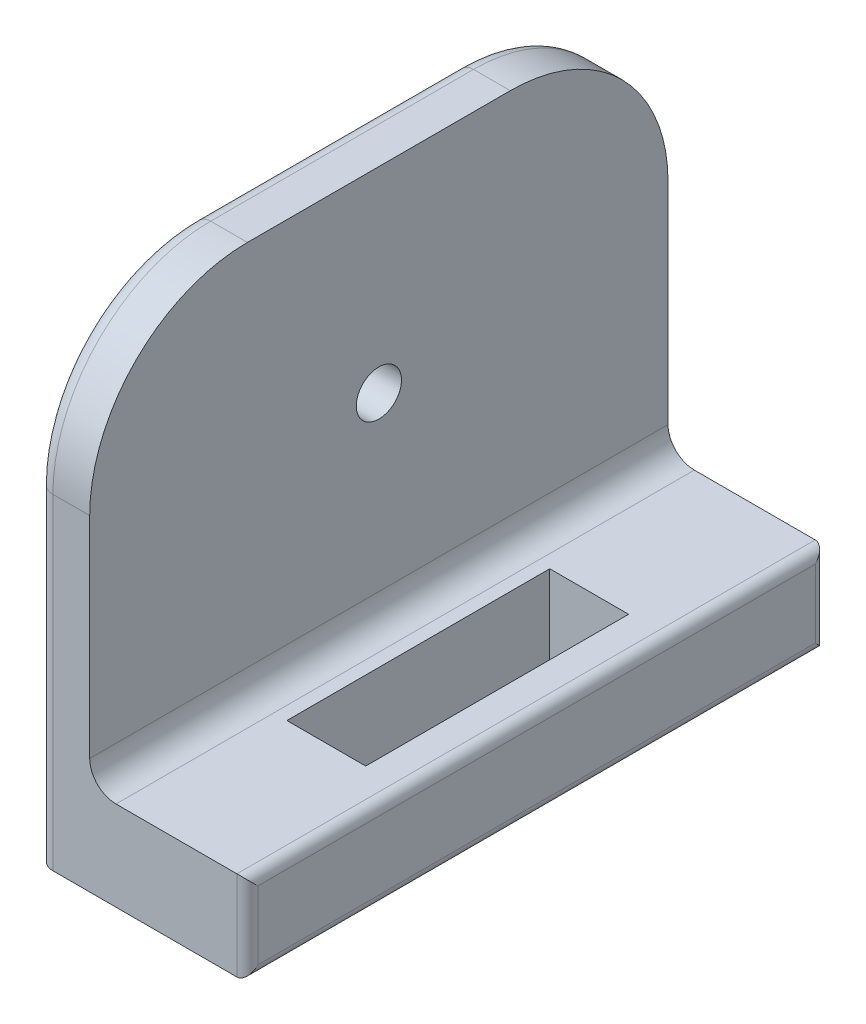
ISO-10303-21;
HEADER;
FILE_DESCRIPTION(('STEP AP214'),'2;1');
FILE_NAME('part.step','',(''),(''),'','','');
FILE_SCHEMA(('AUTOMOTIVE_DESIGN { 1 0 10303 214 1 1 1 1 }'));
ENDSEC;
DATA;
#1=APPLICATION_CONTEXT('core data for automotive mechanical design processes');
#2=APPLICATION_PROTOCOL_DEFINITION('international standard','automotive_design',2000,#1);
#3=PRODUCT_CONTEXT('',#1,'mechanical');
#4=PRODUCT('Part','Part','',(#3));
#5=PRODUCT_RELATED_PRODUCT_CATEGORY('part','',(#4));
#6=PRODUCT_DEFINITION_FORMATION('','',#4);
#7=PRODUCT_DEFINITION_CONTEXT('part definition',#1,'design');
#8=PRODUCT_DEFINITION('design','',#6,#7);
#9=PRODUCT_DEFINITION_SHAPE('','',#8);
#10=(LENGTH_UNIT() NAMED_UNIT(*) SI_UNIT(.MILLI.,.METRE.));
#11=(NAMED_UNIT(*) PLANE_ANGLE_UNIT() SI_UNIT($,.RADIAN.));
#12=(NAMED_UNIT(*) SI_UNIT($,.STERADIAN.) SOLID_ANGLE_UNIT());
#13=UNCERTAINTY_MEASURE_WITH_UNIT(LENGTH_MEASURE(1.E-05),#10,'distance_accuracy_value','');
#14=(GEOMETRIC_REPRESENTATION_CONTEXT(3) GLOBAL_UNCERTAINTY_ASSIGNED_CONTEXT((#13)) GLOBAL_UNIT_ASSIGNED_CONTEXT((#10,
#11,#12)) REPRESENTATION_CONTEXT('',''));
#15=CARTESIAN_POINT('',(0.,0.,0.));
#16=DIRECTION('',(0.,0.,1.));
#17=DIRECTION('',(1.,0.,0.));
#18=AXIS2_PLACEMENT_3D('',#15,#16,#17);
#19=CARTESIAN_POINT('',(0.,17.,0.));
#20=DIRECTION('',(0.,-1.,0.));
#21=DIRECTION('',(0.,0.,-1.));
#22=AXIS2_PLACEMENT_3D('',#19,#20,#21);
#23=PLANE('',#22);
#24=DIRECTION('',(0.,0.,-1.));
#25=VECTOR('',#24,1.);
#26=CARTESIAN_POINT('',(32.5,17.,-80.));
#27=LINE('',#26,#25);
#28=CARTESIAN_POINT('',(32.5,17.,-30.));
#29=VERTEX_POINT('',#28);
#30=CARTESIAN_POINT('',(32.5,17.,-80.));
#31=VERTEX_POINT('',#30);
#32=EDGE_CURVE('E201',#29,#31,#27,.T.);
#33=ORIENTED_EDGE('',*,*,#32,.F.);
#34=DIRECTION('',(1.,0.,0.));
#35=VECTOR('',#34,1.);
#36=CARTESIAN_POINT('',(17.5,17.,-30.));
#37=LINE('',#36,#35);
#38=CARTESIAN_POINT('',(17.5,17.,-30.));
#39=VERTEX_POINT('',#38);
#40=EDGE_CURVE('E190',#39,#29,#37,.T.);
#41=ORIENTED_EDGE('',*,*,#40,.F.);
#42=DIRECTION('',(0.,0.,1.));
#43=VECTOR('',#42,1.);
#44=CARTESIAN_POINT('',(17.5,17.,-80.));
#45=LINE('',#44,#43);
#46=CARTESIAN_POINT('',(17.5,17.,-80.));
#47=VERTEX_POINT('',#46);
#48=EDGE_CURVE('E205',#47,#39,#45,.T.);
#49=ORIENTED_EDGE('',*,*,#48,.F.);
#50=DIRECTION('',(-1.,0.,0.));
#51=VECTOR('',#50,1.);
#52=CARTESIAN_POINT('',(17.5,17.,-80.));
#53=LINE('',#52,#51);
#54=EDGE_CURVE('E198',#31,#47,#53,.T.);
#55=ORIENTED_EDGE('',*,*,#54,.F.);
#56=EDGE_LOOP('',(#33,#41,#49,#55));
#57=FACE_BOUND('',#56,.T.);
#58=DIRECTION('',(1.,0.,0.));
#59=VECTOR('',#58,1.);
#60=CARTESIAN_POINT('',(0.,17.,0.));
#61=LINE('',#60,#59);
#62=CARTESIAN_POINT('',(15.,17.,0.));
#63=VERTEX_POINT('',#62);
#64=CARTESIAN_POINT('',(38.,17.,0.));
#65=VERTEX_POINT('',#64);
#66=EDGE_CURVE('E233',#63,#65,#61,.T.);
#67=ORIENTED_EDGE('',*,*,#66,.T.);
#68=DIRECTION('',(0.,0.,-1.));
#69=VECTOR('',#68,1.);
#70=CARTESIAN_POINT('',(38.,17.,0.));
#71=LINE('',#70,#69);
#72=CARTESIAN_POINT('',(38.,17.,-110.));
#73=VERTEX_POINT('',#72);
#74=EDGE_CURVE('E70',#65,#73,#71,.T.);
#75=ORIENTED_EDGE('',*,*,#74,.T.);
#76=DIRECTION('',(-1.,0.,0.));
#77=VECTOR('',#76,1.);
#78=CARTESIAN_POINT('',(0.,17.,-110.));
#79=LINE('',#78,#77);
#80=CARTESIAN_POINT('',(15.,17.,-110.));
#81=VERTEX_POINT('',#80);
#82=EDGE_CURVE('E236',#73,#81,#79,.T.);
#83=ORIENTED_EDGE('',*,*,#82,.T.);
#84=DIRECTION('',(0.,0.,-1.));
#85=VECTOR('',#84,1.);
#86=CARTESIAN_POINT('',(15.,17.,0.));
#87=LINE('',#86,#85);
#88=EDGE_CURVE('E328',#81,#63,#87,.F.);
#89=ORIENTED_EDGE('',*,*,#88,.T.);
#90=EDGE_LOOP('',(#67,#75,#83,#89));
#91=FACE_BOUND('',#90,.T.);
#92=ADVANCED_FACE('F45',(#57,#91),#23,.F.);
#93=CARTESIAN_POINT('',(0.,17.,0.));
#94=DIRECTION('',(1.,0.,0.));
#95=DIRECTION('',(0.,0.,-1.));
#96=AXIS2_PLACEMENT_3D('',#93,#94,#95);
#97=PLANE('',#96);
#98=CARTESIAN_POINT('',(0.,54.7,-55.));
#99=DIRECTION('',(1.,0.,0.));
#100=DIRECTION('',(0.,0.,-1.));
#101=AXIS2_PLACEMENT_3D('',#98,#99,#100);
#102=CIRCLE('',#101,4.3);
#103=CARTESIAN_POINT('',(0.,54.7,-59.3));
#104=VERTEX_POINT('',#103);
#105=EDGE_CURVE('E667',#104,#104,#102,.F.);
#106=ORIENTED_EDGE('',*,*,#105,.F.);
#107=EDGE_LOOP('',(#106));
#108=FACE_BOUND('',#107,.T.);
#109=DIRECTION('',(0.,0.,1.));
#110=VECTOR('',#109,1.);
#111=CARTESIAN_POINT('',(0.,0.,0.));
#112=LINE('',#111,#110);
#113=CARTESIAN_POINT('',(0.,0.,-107.));
#114=VERTEX_POINT('',#113);
#115=CARTESIAN_POINT('',(0.,0.,-3.));
#116=VERTEX_POINT('',#115);
#117=EDGE_CURVE('E232',#114,#116,#112,.T.);
#118=ORIENTED_EDGE('',*,*,#117,.T.);
#119=DIRECTION('',(0.,-1.,0.));
#120=VECTOR('',#119,1.);
#121=CARTESIAN_POINT('',(0.,17.,-3.));
#122=LINE('',#121,#120);
#123=CARTESIAN_POINT('',(0.,62.,-3.));
#124=VERTEX_POINT('',#123);
#125=EDGE_CURVE('E283',#116,#124,#122,.F.);
#126=ORIENTED_EDGE('',*,*,#125,.T.);
#127=CARTESIAN_POINT('',(0.,62.,-30.));
#128=DIRECTION('',(1.,0.,0.));
#129=DIRECTION('',(0.,0.,-1.));
#130=AXIS2_PLACEMENT_3D('',#127,#128,#129);
#131=CIRCLE('',#130,27.);
#132=CARTESIAN_POINT('',(0.,89.,-30.));
#133=VERTEX_POINT('',#132);
#134=EDGE_CURVE('E279',#124,#133,#131,.F.);
#135=ORIENTED_EDGE('',*,*,#134,.T.);
#136=DIRECTION('',(0.,0.,1.));
#137=VECTOR('',#136,1.);
#138=CARTESIAN_POINT('',(0.,89.,0.));
#139=LINE('',#138,#137);
#140=CARTESIAN_POINT('',(0.,89.,-80.));
#141=VERTEX_POINT('',#140);
#142=EDGE_CURVE('E276',#133,#141,#139,.F.);
#143=ORIENTED_EDGE('',*,*,#142,.T.);
#144=CARTESIAN_POINT('',(0.,62.,-80.));
#145=DIRECTION('',(1.,0.,0.));
#146=DIRECTION('',(0.,0.,-1.));
#147=AXIS2_PLACEMENT_3D('',#144,#145,#146);
#148=CIRCLE('',#147,27.);
#149=CARTESIAN_POINT('',(0.,62.,-107.));
#150=VERTEX_POINT('',#149);
#151=EDGE_CURVE('E273',#141,#150,#148,.F.);
#152=ORIENTED_EDGE('',*,*,#151,.T.);
#153=DIRECTION('',(0.,-1.,0.));
#154=VECTOR('',#153,1.);
#155=CARTESIAN_POINT('',(0.,17.,-107.));
#156=LINE('',#155,#154);
#157=EDGE_CURVE('E270',#150,#114,#156,.T.);
#158=ORIENTED_EDGE('',*,*,#157,.T.);
#159=EDGE_LOOP('',(#118,#126,#135,#143,#152,#158));
#160=FACE_BOUND('',#159,.T.);
#161=ADVANCED_FACE('F402',(#108,#160),#97,.F.);
#162=CARTESIAN_POINT('',(0.,17.,0.));
#163=DIRECTION('',(0.,0.,-1.));
#164=DIRECTION('',(-1.,0.,0.));
#165=AXIS2_PLACEMENT_3D('',#162,#163,#164);
#166=PLANE('',#165);
#167=DIRECTION('',(1.,0.,0.));
#168=VECTOR('',#167,1.);
#169=CARTESIAN_POINT('',(0.,0.,0.));
#170=LINE('',#169,#168);
#171=CARTESIAN_POINT('',(3.,0.,0.));
#172=VERTEX_POINT('',#171);
#173=CARTESIAN_POINT('',(38.,0.,0.));
#174=VERTEX_POINT('',#173);
#175=EDGE_CURVE('E244',#172,#174,#170,.T.);
#176=ORIENTED_EDGE('',*,*,#175,.T.);
#177=DIRECTION('',(0.,-1.,0.));
#178=VECTOR('',#177,1.);
#179=CARTESIAN_POINT('',(38.,17.,0.));
#180=LINE('',#179,#178);
#181=EDGE_CURVE('E351',#174,#65,#180,.F.);
#182=ORIENTED_EDGE('',*,*,#181,.T.);
#183=ORIENTED_EDGE('',*,*,#66,.F.);
#184=CARTESIAN_POINT('',(15.,22.,0.));
#185=DIRECTION('',(0.,0.,-1.));
#186=DIRECTION('',(-1.,0.,0.));
#187=AXIS2_PLACEMENT_3D('',#184,#185,#186);
#188=CIRCLE('',#187,5.);
#189=CARTESIAN_POINT('',(10.,22.,0.));
#190=VERTEX_POINT('',#189);
#191=EDGE_CURVE('E335',#63,#190,#188,.T.);
#192=ORIENTED_EDGE('',*,*,#191,.T.);
#193=DIRECTION('',(0.,-1.,0.));
#194=VECTOR('',#193,1.);
#195=CARTESIAN_POINT('',(10.,17.,0.));
#196=LINE('',#195,#194);
#197=CARTESIAN_POINT('',(10.,62.,0.));
#198=VERTEX_POINT('',#197);
#199=EDGE_CURVE('E221',#198,#190,#196,.T.);
#200=ORIENTED_EDGE('',*,*,#199,.F.);
#201=DIRECTION('',(-1.,0.,0.));
#202=VECTOR('',#201,1.);
#203=CARTESIAN_POINT('',(0.,62.,0.));
#204=LINE('',#203,#202);
#205=CARTESIAN_POINT('',(3.,62.,0.));
#206=VERTEX_POINT('',#205);
#207=EDGE_CURVE('E240',#198,#206,#204,.T.);
#208=ORIENTED_EDGE('',*,*,#207,.T.);
#209=DIRECTION('',(0.,-1.,0.));
#210=VECTOR('',#209,1.);
#211=CARTESIAN_POINT('',(3.,17.,0.));
#212=LINE('',#211,#210);
#213=EDGE_CURVE('E295',#206,#172,#212,.T.);
#214=ORIENTED_EDGE('',*,*,#213,.T.);
#215=EDGE_LOOP('',(#176,#182,#183,#192,#200,#208,#214));
#216=FACE_BOUND('',#215,.T.);
#217=ADVANCED_FACE('F386',(#216),#166,.F.);
#218=CARTESIAN_POINT('',(40.,17.,0.));
#219=DIRECTION('',(-1.,0.,0.));
#220=DIRECTION('',(0.,0.,1.));
#221=AXIS2_PLACEMENT_3D('',#218,#219,#220);
#222=PLANE('',#221);
#223=DIRECTION('',(0.,0.,-1.));
#224=VECTOR('',#223,1.);
#225=CARTESIAN_POINT('',(40.,15.,0.));
#226=LINE('',#225,#224);
#227=CARTESIAN_POINT('',(40.,15.,-108.));
#228=VERTEX_POINT('',#227);
#229=CARTESIAN_POINT('',(40.,15.,-2.));
#230=VERTEX_POINT('',#229);
#231=EDGE_CURVE('E344',#228,#230,#226,.F.);
#232=ORIENTED_EDGE('',*,*,#231,.T.);
#233=DIRECTION('',(0.,-1.,0.));
#234=VECTOR('',#233,1.);
#235=CARTESIAN_POINT('',(40.,17.,-2.));
#236=LINE('',#235,#234);
#237=CARTESIAN_POINT('',(40.,2.,-2.));
#238=VERTEX_POINT('',#237);
#239=EDGE_CURVE('E347',#230,#238,#236,.T.);
#240=ORIENTED_EDGE('',*,*,#239,.T.);
#241=DIRECTION('',(0.,0.,-1.));
#242=VECTOR('',#241,1.);
#243=CARTESIAN_POINT('',(40.,2.,-110.));
#244=LINE('',#243,#242);
#245=CARTESIAN_POINT('',(40.,2.,-108.));
#246=VERTEX_POINT('',#245);
#247=EDGE_CURVE('E338',#238,#246,#244,.T.);
#248=ORIENTED_EDGE('',*,*,#247,.T.);
#249=DIRECTION('',(0.,-1.,0.));
#250=VECTOR('',#249,1.);
#251=CARTESIAN_POINT('',(40.,17.,-108.));
#252=LINE('',#251,#250);
#253=EDGE_CURVE('E341',#246,#228,#252,.F.);
#254=ORIENTED_EDGE('',*,*,#253,.T.);
#255=EDGE_LOOP('',(#232,#240,#248,#254));
#256=FACE_BOUND('',#255,.T.);
#257=ADVANCED_FACE('F393',(#256),#222,.F.);
#258=CARTESIAN_POINT('',(0.,17.,-110.));
#259=DIRECTION('',(0.,0.,1.));
#260=DIRECTION('',(1.,0.,0.));
#261=AXIS2_PLACEMENT_3D('',#258,#259,#260);
#262=PLANE('',#261);
#263=ORIENTED_EDGE('',*,*,#82,.F.);
#264=DIRECTION('',(0.,-1.,0.));
#265=VECTOR('',#264,1.);
#266=CARTESIAN_POINT('',(38.,17.,-110.));
#267=LINE('',#266,#265);
#268=CARTESIAN_POINT('',(38.,0.,-110.));
#269=VERTEX_POINT('',#268);
#270=EDGE_CURVE('E55',#73,#269,#267,.T.);
#271=ORIENTED_EDGE('',*,*,#270,.T.);
#272=DIRECTION('',(-1.,0.,0.));
#273=VECTOR('',#272,1.);
#274=CARTESIAN_POINT('',(0.,0.,-110.));
#275=LINE('',#274,#273);
#276=CARTESIAN_POINT('',(3.,0.,-110.));
#277=VERTEX_POINT('',#276);
#278=EDGE_CURVE('E237',#269,#277,#275,.T.);
#279=ORIENTED_EDGE('',*,*,#278,.T.);
#280=DIRECTION('',(0.,-1.,0.));
#281=VECTOR('',#280,1.);
#282=CARTESIAN_POINT('',(3.,17.,-110.));
#283=LINE('',#282,#281);
#284=CARTESIAN_POINT('',(3.,62.,-110.));
#285=VERTEX_POINT('',#284);
#286=EDGE_CURVE('E305',#277,#285,#283,.F.);
#287=ORIENTED_EDGE('',*,*,#286,.T.);
#288=DIRECTION('',(-1.,0.,0.));
#289=VECTOR('',#288,1.);
#290=CARTESIAN_POINT('',(0.,62.,-110.));
#291=LINE('',#290,#289);
#292=CARTESIAN_POINT('',(10.,62.,-110.));
#293=VERTEX_POINT('',#292);
#294=EDGE_CURVE('E266',#285,#293,#291,.F.);
#295=ORIENTED_EDGE('',*,*,#294,.T.);
#296=DIRECTION('',(0.,1.,0.));
#297=VECTOR('',#296,1.);
#298=CARTESIAN_POINT('',(10.,17.,-110.));
#299=LINE('',#298,#297);
#300=CARTESIAN_POINT('',(10.,22.,-110.));
#301=VERTEX_POINT('',#300);
#302=EDGE_CURVE('E225',#301,#293,#299,.T.);
#303=ORIENTED_EDGE('',*,*,#302,.F.);
#304=CARTESIAN_POINT('',(15.,22.,-110.));
#305=DIRECTION('',(0.,0.,1.));
#306=DIRECTION('',(1.,0.,0.));
#307=AXIS2_PLACEMENT_3D('',#304,#305,#306);
#308=CIRCLE('',#307,5.);
#309=EDGE_CURVE('E331',#301,#81,#308,.T.);
#310=ORIENTED_EDGE('',*,*,#309,.T.);
#311=EDGE_LOOP('',(#263,#271,#279,#287,#295,#303,#310));
#312=FACE_BOUND('',#311,.T.);
#313=ADVANCED_FACE('F395',(#312),#262,.F.);
#314=CARTESIAN_POINT('',(0.,0.,0.));
#315=DIRECTION('',(0.,-1.,0.));
#316=DIRECTION('',(0.,0.,-1.));
#317=AXIS2_PLACEMENT_3D('',#314,#315,#316);
#318=PLANE('',#317);
#319=DIRECTION('',(1.,0.,0.));
#320=VECTOR('',#319,1.);
#321=CARTESIAN_POINT('',(17.5,0.,-30.));
#322=LINE('',#321,#320);
#323=CARTESIAN_POINT('',(17.5,0.,-30.));
#324=VERTEX_POINT('',#323);
#325=CARTESIAN_POINT('',(32.5,0.,-30.));
#326=VERTEX_POINT('',#325);
#327=EDGE_CURVE('E187',#324,#326,#322,.T.);
#328=ORIENTED_EDGE('',*,*,#327,.T.);
#329=DIRECTION('',(0.,0.,-1.));
#330=VECTOR('',#329,1.);
#331=CARTESIAN_POINT('',(32.5,0.,-80.));
#332=LINE('',#331,#330);
#333=CARTESIAN_POINT('',(32.5,0.,-80.));
#334=VERTEX_POINT('',#333);
#335=EDGE_CURVE('E172',#326,#334,#332,.T.);
#336=ORIENTED_EDGE('',*,*,#335,.T.);
#337=DIRECTION('',(-1.,0.,0.));
#338=VECTOR('',#337,1.);
#339=CARTESIAN_POINT('',(17.5,0.,-80.));
#340=LINE('',#339,#338);
#341=CARTESIAN_POINT('',(17.5,0.,-80.));
#342=VERTEX_POINT('',#341);
#343=EDGE_CURVE('E211',#334,#342,#340,.T.);
#344=ORIENTED_EDGE('',*,*,#343,.T.);
#345=DIRECTION('',(0.,0.,1.));
#346=VECTOR('',#345,1.);
#347=CARTESIAN_POINT('',(17.5,0.,-80.));
#348=LINE('',#347,#346);
#349=EDGE_CURVE('E196',#342,#324,#348,.T.);
#350=ORIENTED_EDGE('',*,*,#349,.T.);
#351=EDGE_LOOP('',(#328,#336,#344,#350));
#352=FACE_BOUND('',#351,.T.);
#353=ORIENTED_EDGE('',*,*,#278,.F.);
#354=DIRECTION('',(0.,0.,-1.));
#355=VECTOR('',#354,1.);
#356=CARTESIAN_POINT('',(38.,0.,0.));
#357=LINE('',#356,#355);
#358=EDGE_CURVE('E11',#269,#174,#357,.F.);
#359=ORIENTED_EDGE('',*,*,#358,.T.);
#360=ORIENTED_EDGE('',*,*,#175,.F.);
#361=CARTESIAN_POINT('',(3.,0.,-3.));
#362=DIRECTION('',(0.,-1.,0.));
#363=DIRECTION('',(0.,0.,-1.));
#364=AXIS2_PLACEMENT_3D('',#361,#362,#363);
#365=CIRCLE('',#364,3.);
#366=EDGE_CURVE('E302',#172,#116,#365,.T.);
#367=ORIENTED_EDGE('',*,*,#366,.T.);
#368=ORIENTED_EDGE('',*,*,#117,.F.);
#369=CARTESIAN_POINT('',(3.,0.,-107.));
#370=DIRECTION('',(0.,-1.,0.));
#371=DIRECTION('',(0.,0.,-1.));
#372=AXIS2_PLACEMENT_3D('',#369,#370,#371);
#373=CIRCLE('',#372,3.);
#374=EDGE_CURVE('E298',#114,#277,#373,.T.);
#375=ORIENTED_EDGE('',*,*,#374,.T.);
#376=EDGE_LOOP('',(#353,#359,#360,#367,#368,#375));
#377=FACE_BOUND('',#376,.T.);
#378=ADVANCED_FACE('F194',(#352,#377),#318,.T.);
#379=CARTESIAN_POINT('',(10.,92.,0.));
#380=DIRECTION('',(0.,-1.,0.));
#381=DIRECTION('',(0.,0.,-1.));
#382=AXIS2_PLACEMENT_3D('',#379,#380,#381);
#383=PLANE('',#382);
#384=DIRECTION('',(-1.,0.,0.));
#385=VECTOR('',#384,1.);
#386=CARTESIAN_POINT('',(10.,92.,-80.));
#387=LINE('',#386,#385);
#388=CARTESIAN_POINT('',(10.,92.,-80.));
#389=VERTEX_POINT('',#388);
#390=CARTESIAN_POINT('',(3.,92.,-80.));
#391=VERTEX_POINT('',#390);
#392=EDGE_CURVE('E253',#389,#391,#387,.T.);
#393=ORIENTED_EDGE('',*,*,#392,.T.);
#394=DIRECTION('',(0.,0.,1.));
#395=VECTOR('',#394,1.);
#396=CARTESIAN_POINT('',(3.,92.,0.));
#397=LINE('',#396,#395);
#398=CARTESIAN_POINT('',(3.,92.,-30.));
#399=VERTEX_POINT('',#398);
#400=EDGE_CURVE('E289',#391,#399,#397,.T.);
#401=ORIENTED_EDGE('',*,*,#400,.T.);
#402=DIRECTION('',(-1.,0.,0.));
#403=VECTOR('',#402,1.);
#404=CARTESIAN_POINT('',(10.,92.,-30.));
#405=LINE('',#404,#403);
#406=CARTESIAN_POINT('',(10.,92.,-30.));
#407=VERTEX_POINT('',#406);
#408=EDGE_CURVE('E257',#399,#407,#405,.F.);
#409=ORIENTED_EDGE('',*,*,#408,.T.);
#410=DIRECTION('',(0.,0.,1.));
#411=VECTOR('',#410,1.);
#412=CARTESIAN_POINT('',(10.,92.,0.));
#413=LINE('',#412,#411);
#414=EDGE_CURVE('E228',#389,#407,#413,.T.);
#415=ORIENTED_EDGE('',*,*,#414,.F.);
#416=EDGE_LOOP('',(#393,#401,#409,#415));
#417=FACE_BOUND('',#416,.T.);
#418=ADVANCED_FACE('F415',(#417),#383,.F.);
#419=CARTESIAN_POINT('',(10.,0.,0.));
#420=DIRECTION('',(-1.,0.,0.));
#421=DIRECTION('',(0.,0.,1.));
#422=AXIS2_PLACEMENT_3D('',#419,#420,#421);
#423=PLANE('',#422);
#424=CARTESIAN_POINT('',(10.,54.7,-55.));
#425=DIRECTION('',(1.,0.,0.));
#426=DIRECTION('',(0.,0.,-1.));
#427=AXIS2_PLACEMENT_3D('',#424,#425,#426);
#428=CIRCLE('',#427,4.3);
#429=CARTESIAN_POINT('',(10.,54.7,-59.3));
#430=VERTEX_POINT('',#429);
#431=EDGE_CURVE('E324',#430,#430,#428,.T.);
#432=ORIENTED_EDGE('',*,*,#431,.F.);
#433=EDGE_LOOP('',(#432));
#434=FACE_BOUND('',#433,.T.);
#435=ORIENTED_EDGE('',*,*,#199,.T.);
#436=DIRECTION('',(0.,0.,-1.));
#437=VECTOR('',#436,1.);
#438=CARTESIAN_POINT('',(10.,22.,-110.));
#439=LINE('',#438,#437);
#440=EDGE_CURVE('E308',#190,#301,#439,.T.);
#441=ORIENTED_EDGE('',*,*,#440,.T.);
#442=ORIENTED_EDGE('',*,*,#302,.T.);
#443=CARTESIAN_POINT('',(10.,62.,-80.));
#444=DIRECTION('',(-1.,0.,0.));
#445=DIRECTION('',(0.,0.,1.));
#446=AXIS2_PLACEMENT_3D('',#443,#444,#445);
#447=CIRCLE('',#446,30.);
#448=EDGE_CURVE('E260',#293,#389,#447,.F.);
#449=ORIENTED_EDGE('',*,*,#448,.T.);
#450=ORIENTED_EDGE('',*,*,#414,.T.);
#451=CARTESIAN_POINT('',(10.,62.,-30.));
#452=DIRECTION('',(-1.,0.,0.));
#453=DIRECTION('',(0.,0.,1.));
#454=AXIS2_PLACEMENT_3D('',#451,#452,#453);
#455=CIRCLE('',#454,30.);
#456=EDGE_CURVE('E263',#407,#198,#455,.F.);
#457=ORIENTED_EDGE('',*,*,#456,.T.);
#458=EDGE_LOOP('',(#435,#441,#442,#449,#450,#457));
#459=FACE_BOUND('',#458,.T.);
#460=ADVANCED_FACE('F422',(#434,#459),#423,.F.);
#461=CARTESIAN_POINT('',(17.5,-52.2015325445528,-30.));
#462=DIRECTION('',(0.,0.,1.));
#463=DIRECTION('',(1.,0.,0.));
#464=AXIS2_PLACEMENT_3D('',#461,#462,#463);
#465=PLANE('',#464);
#466=DIRECTION('',(0.,1.,0.));
#467=VECTOR('',#466,1.);
#468=CARTESIAN_POINT('',(17.5,-52.2015325445528,-30.));
#469=LINE('',#468,#467);
#470=EDGE_CURVE('E209',#324,#39,#469,.T.);
#471=ORIENTED_EDGE('',*,*,#470,.T.);
#472=ORIENTED_EDGE('',*,*,#40,.T.);
#473=DIRECTION('',(0.,1.,0.));
#474=VECTOR('',#473,1.);
#475=CARTESIAN_POINT('',(32.5,-52.2015325445528,-30.));
#476=LINE('',#475,#474);
#477=EDGE_CURVE('E176',#326,#29,#476,.T.);
#478=ORIENTED_EDGE('',*,*,#477,.F.);
#479=ORIENTED_EDGE('',*,*,#327,.F.);
#480=EDGE_LOOP('',(#471,#472,#478,#479));
#481=FACE_BOUND('',#480,.T.);
#482=ADVANCED_FACE('F186',(#481),#465,.F.);
#483=CARTESIAN_POINT('',(32.5,-52.2015325445528,-80.));
#484=DIRECTION('',(1.,0.,0.));
#485=DIRECTION('',(0.,0.,-1.));
#486=AXIS2_PLACEMENT_3D('',#483,#484,#485);
#487=PLANE('',#486);
#488=ORIENTED_EDGE('',*,*,#477,.T.);
#489=ORIENTED_EDGE('',*,*,#32,.T.);
#490=DIRECTION('',(0.,1.,0.));
#491=VECTOR('',#490,1.);
#492=CARTESIAN_POINT('',(32.5,-52.2015325445528,-80.));
#493=LINE('',#492,#491);
#494=EDGE_CURVE('E178',#334,#31,#493,.T.);
#495=ORIENTED_EDGE('',*,*,#494,.F.);
#496=ORIENTED_EDGE('',*,*,#335,.F.);
#497=EDGE_LOOP('',(#488,#489,#495,#496));
#498=FACE_BOUND('',#497,.T.);
#499=ADVANCED_FACE('F174',(#498),#487,.F.);
#500=CARTESIAN_POINT('',(17.5,-52.2015325445528,-80.));
#501=DIRECTION('',(0.,0.,-1.));
#502=DIRECTION('',(-1.,0.,0.));
#503=AXIS2_PLACEMENT_3D('',#500,#501,#502);
#504=PLANE('',#503);
#505=ORIENTED_EDGE('',*,*,#494,.T.);
#506=ORIENTED_EDGE('',*,*,#54,.T.);
#507=DIRECTION('',(0.,1.,0.));
#508=VECTOR('',#507,1.);
#509=CARTESIAN_POINT('',(17.5,-52.2015325445528,-80.));
#510=LINE('',#509,#508);
#511=EDGE_CURVE('E210',#342,#47,#510,.T.);
#512=ORIENTED_EDGE('',*,*,#511,.F.);
#513=ORIENTED_EDGE('',*,*,#343,.F.);
#514=EDGE_LOOP('',(#505,#506,#512,#513));
#515=FACE_BOUND('',#514,.T.);
#516=ADVANCED_FACE('F573',(#515),#504,.F.);
#517=CARTESIAN_POINT('',(17.5,-52.2015325445528,-80.));
#518=DIRECTION('',(-1.,0.,0.));
#519=DIRECTION('',(0.,0.,1.));
#520=AXIS2_PLACEMENT_3D('',#517,#518,#519);
#521=PLANE('',#520);
#522=ORIENTED_EDGE('',*,*,#511,.T.);
#523=ORIENTED_EDGE('',*,*,#48,.T.);
#524=ORIENTED_EDGE('',*,*,#470,.F.);
#525=ORIENTED_EDGE('',*,*,#349,.F.);
#526=EDGE_LOOP('',(#522,#523,#524,#525));
#527=FACE_BOUND('',#526,.T.);
#528=ADVANCED_FACE('F564',(#527),#521,.F.);
#529=CARTESIAN_POINT('',(-12.1622366364086,54.7,-55.));
#530=DIRECTION('',(1.,0.,0.));
#531=DIRECTION('',(0.,0.,-1.));
#532=AXIS2_PLACEMENT_3D('',#529,#530,#531);
#533=CYLINDRICAL_SURFACE('',#532,4.3);
#534=ORIENTED_EDGE('',*,*,#105,.T.);
#535=EDGE_LOOP('',(#534));
#536=FACE_BOUND('',#535,.T.);
#537=ORIENTED_EDGE('',*,*,#431,.T.);
#538=EDGE_LOOP('',(#537));
#539=FACE_BOUND('',#538,.T.);
#540=ADVANCED_FACE('F556',(#536,#539),#533,.F.);
#541=CARTESIAN_POINT('',(0.,62.,-30.));
#542=DIRECTION('',(-1.,0.,0.));
#543=DIRECTION('',(0.,0.,1.));
#544=AXIS2_PLACEMENT_3D('',#541,#542,#543);
#545=CYLINDRICAL_SURFACE('',#544,30.);
#546=ORIENTED_EDGE('',*,*,#408,.F.);
#547=CARTESIAN_POINT('',(3.,62.,-30.));
#548=DIRECTION('',(1.,0.,0.));
#549=DIRECTION('',(0.,0.,-1.));
#550=AXIS2_PLACEMENT_3D('',#547,#548,#549);
#551=CIRCLE('',#550,30.);
#552=EDGE_CURVE('E286',#399,#206,#551,.T.);
#553=ORIENTED_EDGE('',*,*,#552,.T.);
#554=ORIENTED_EDGE('',*,*,#207,.F.);
#555=ORIENTED_EDGE('',*,*,#456,.F.);
#556=EDGE_LOOP('',(#546,#553,#554,#555));
#557=FACE_BOUND('',#556,.T.);
#558=ADVANCED_FACE('F451',(#557),#545,.T.);
#559=CARTESIAN_POINT('',(10.,62.,-80.));
#560=DIRECTION('',(-1.,0.,0.));
#561=DIRECTION('',(0.,0.,1.));
#562=AXIS2_PLACEMENT_3D('',#559,#560,#561);
#563=CYLINDRICAL_SURFACE('',#562,30.);
#564=ORIENTED_EDGE('',*,*,#294,.F.);
#565=CARTESIAN_POINT('',(3.,62.,-80.));
#566=DIRECTION('',(1.,0.,0.));
#567=DIRECTION('',(0.,0.,-1.));
#568=AXIS2_PLACEMENT_3D('',#565,#566,#567);
#569=CIRCLE('',#568,30.);
#570=EDGE_CURVE('E292',#285,#391,#569,.T.);
#571=ORIENTED_EDGE('',*,*,#570,.T.);
#572=ORIENTED_EDGE('',*,*,#392,.F.);
#573=ORIENTED_EDGE('',*,*,#448,.F.);
#574=EDGE_LOOP('',(#564,#571,#572,#573));
#575=FACE_BOUND('',#574,.T.);
#576=ADVANCED_FACE('F467',(#575),#563,.T.);
#577=CARTESIAN_POINT('',(3.,17.,-107.));
#578=DIRECTION('',(0.,-1.,0.));
#579=DIRECTION('',(0.,0.,-1.));
#580=AXIS2_PLACEMENT_3D('',#577,#578,#579);
#581=CYLINDRICAL_SURFACE('',#580,3.);
#582=ORIENTED_EDGE('',*,*,#374,.F.);
#583=ORIENTED_EDGE('',*,*,#157,.F.);
#584=CARTESIAN_POINT('',(3.,62.,-107.));
#585=DIRECTION('',(0.,1.,0.));
#586=DIRECTION('',(0.,0.,1.));
#587=AXIS2_PLACEMENT_3D('',#584,#585,#586);
#588=CIRCLE('',#587,3.);
#589=EDGE_CURVE('E320',#285,#150,#588,.T.);
#590=ORIENTED_EDGE('',*,*,#589,.F.);
#591=ORIENTED_EDGE('',*,*,#286,.F.);
#592=EDGE_LOOP('',(#582,#583,#590,#591));
#593=FACE_BOUND('',#592,.T.);
#594=ADVANCED_FACE('F463',(#593),#581,.T.);
#595=CARTESIAN_POINT('',(3.,62.,-80.));
#596=DIRECTION('',(1.,0.,0.));
#597=DIRECTION('',(0.,0.,-1.));
#598=AXIS2_PLACEMENT_3D('',#595,#596,#597);
#599=TOROIDAL_SURFACE('',#598,27.,3.);
#600=ORIENTED_EDGE('',*,*,#589,.T.);
#601=ORIENTED_EDGE('',*,*,#151,.F.);
#602=CARTESIAN_POINT('',(3.,89.,-80.));
#603=DIRECTION('',(0.,0.,1.));
#604=DIRECTION('',(1.,0.,0.));
#605=AXIS2_PLACEMENT_3D('',#602,#603,#604);
#606=CIRCLE('',#605,3.);
#607=EDGE_CURVE('E316',#391,#141,#606,.T.);
#608=ORIENTED_EDGE('',*,*,#607,.F.);
#609=ORIENTED_EDGE('',*,*,#570,.F.);
#610=EDGE_LOOP('',(#600,#601,#608,#609));
#611=FACE_BOUND('',#610,.T.);
#612=ADVANCED_FACE('F439',(#611),#599,.T.);
#613=CARTESIAN_POINT('',(3.,17.,-3.));
#614=DIRECTION('',(0.,-1.,0.));
#615=DIRECTION('',(0.,0.,-1.));
#616=AXIS2_PLACEMENT_3D('',#613,#614,#615);
#617=CYLINDRICAL_SURFACE('',#616,3.);
#618=ORIENTED_EDGE('',*,*,#366,.F.);
#619=ORIENTED_EDGE('',*,*,#213,.F.);
#620=CARTESIAN_POINT('',(3.,62.,-3.));
#621=DIRECTION('',(0.,1.,0.));
#622=DIRECTION('',(0.,0.,1.));
#623=AXIS2_PLACEMENT_3D('',#620,#621,#622);
#624=CIRCLE('',#623,3.);
#625=EDGE_CURVE('E312',#124,#206,#624,.T.);
#626=ORIENTED_EDGE('',*,*,#625,.F.);
#627=ORIENTED_EDGE('',*,*,#125,.F.);
#628=EDGE_LOOP('',(#618,#619,#626,#627));
#629=FACE_BOUND('',#628,.T.);
#630=ADVANCED_FACE('F455',(#629),#617,.T.);
#631=CARTESIAN_POINT('',(3.,89.,0.));
#632=DIRECTION('',(0.,0.,1.));
#633=DIRECTION('',(1.,0.,0.));
#634=AXIS2_PLACEMENT_3D('',#631,#632,#633);
#635=CYLINDRICAL_SURFACE('',#634,3.);
#636=ORIENTED_EDGE('',*,*,#607,.T.);
#637=ORIENTED_EDGE('',*,*,#142,.F.);
#638=CARTESIAN_POINT('',(3.,89.,-30.));
#639=DIRECTION('',(0.,0.,1.));
#640=DIRECTION('',(1.,0.,0.));
#641=AXIS2_PLACEMENT_3D('',#638,#639,#640);
#642=CIRCLE('',#641,3.);
#643=EDGE_CURVE('E309',#399,#133,#642,.T.);
#644=ORIENTED_EDGE('',*,*,#643,.F.);
#645=ORIENTED_EDGE('',*,*,#400,.F.);
#646=EDGE_LOOP('',(#636,#637,#644,#645));
#647=FACE_BOUND('',#646,.T.);
#648=ADVANCED_FACE('F443',(#647),#635,.T.);
#649=CARTESIAN_POINT('',(3.,62.,-30.));
#650=DIRECTION('',(1.,0.,0.));
#651=DIRECTION('',(0.,0.,-1.));
#652=AXIS2_PLACEMENT_3D('',#649,#650,#651);
#653=TOROIDAL_SURFACE('',#652,27.,3.);
#654=ORIENTED_EDGE('',*,*,#625,.T.);
#655=ORIENTED_EDGE('',*,*,#552,.F.);
#656=ORIENTED_EDGE('',*,*,#643,.T.);
#657=ORIENTED_EDGE('',*,*,#134,.F.);
#658=EDGE_LOOP('',(#654,#655,#656,#657));
#659=FACE_BOUND('',#658,.T.);
#660=ADVANCED_FACE('F447',(#659),#653,.T.);
#661=CARTESIAN_POINT('',(15.,22.,0.));
#662=DIRECTION('',(0.,0.,1.));
#663=DIRECTION('',(1.,0.,0.));
#664=AXIS2_PLACEMENT_3D('',#661,#662,#663);
#665=CYLINDRICAL_SURFACE('',#664,5.);
#666=ORIENTED_EDGE('',*,*,#191,.F.);
#667=ORIENTED_EDGE('',*,*,#88,.F.);
#668=ORIENTED_EDGE('',*,*,#309,.F.);
#669=ORIENTED_EDGE('',*,*,#440,.F.);
#670=EDGE_LOOP('',(#666,#667,#668,#669));
#671=FACE_BOUND('',#670,.T.);
#672=ADVANCED_FACE('F473',(#671),#665,.F.);
#673=CARTESIAN_POINT('',(38.,17.,-108.));
#674=DIRECTION('',(0.,-1.,0.));
#675=DIRECTION('',(0.,0.,-1.));
#676=AXIS2_PLACEMENT_3D('',#673,#674,#675);
#677=CYLINDRICAL_SURFACE('',#676,2.);
#678=CARTESIAN_POINT('',(38.,2.,-108.));
#679=DIRECTION('',(0.,-0.707106781186547,0.707106781186547));
#680=DIRECTION('',(0.,0.707106781186547,0.707106781186547));
#681=AXIS2_PLACEMENT_3D('',#678,#679,#680);
#682=ELLIPSE('',#681,2.82842712474619,2.);
#683=EDGE_CURVE('E364',#269,#246,#682,.T.);
#684=ORIENTED_EDGE('',*,*,#683,.F.);
#685=ORIENTED_EDGE('',*,*,#270,.F.);
#686=CARTESIAN_POINT('',(38.,15.,-108.));
#687=DIRECTION('',(0.,-0.707106781186547,-0.707106781186547));
#688=DIRECTION('',(0.,-0.707106781186547,0.707106781186547));
#689=AXIS2_PLACEMENT_3D('',#686,#687,#688);
#690=ELLIPSE('',#689,2.82842712474619,2.);
#691=EDGE_CURVE('E49',#228,#73,#690,.F.);
#692=ORIENTED_EDGE('',*,*,#691,.F.);
#693=ORIENTED_EDGE('',*,*,#253,.F.);
#694=EDGE_LOOP('',(#684,#685,#692,#693));
#695=FACE_BOUND('',#694,.T.);
#696=ADVANCED_FACE('F47',(#695),#677,.T.);
#697=CARTESIAN_POINT('',(38.,15.,0.));
#698=DIRECTION('',(0.,0.,-1.));
#699=DIRECTION('',(-1.,0.,0.));
#700=AXIS2_PLACEMENT_3D('',#697,#698,#699);
#701=CYLINDRICAL_SURFACE('',#700,2.);
#702=ORIENTED_EDGE('',*,*,#691,.T.);
#703=ORIENTED_EDGE('',*,*,#74,.F.);
#704=CARTESIAN_POINT('',(38.,15.,-2.));
#705=DIRECTION('',(0.,0.707106781186547,-0.707106781186547));
#706=DIRECTION('',(0.,-0.707106781186547,-0.707106781186547));
#707=AXIS2_PLACEMENT_3D('',#704,#705,#706);
#708=ELLIPSE('',#707,2.82842712474619,2.);
#709=EDGE_CURVE('E362',#230,#65,#708,.F.);
#710=ORIENTED_EDGE('',*,*,#709,.F.);
#711=ORIENTED_EDGE('',*,*,#231,.F.);
#712=EDGE_LOOP('',(#702,#703,#710,#711));
#713=FACE_BOUND('',#712,.T.);
#714=ADVANCED_FACE('F376',(#713),#701,.T.);
#715=CARTESIAN_POINT('',(38.,2.,0.));
#716=DIRECTION('',(0.,0.,1.));
#717=DIRECTION('',(1.,0.,0.));
#718=AXIS2_PLACEMENT_3D('',#715,#716,#717);
#719=CYLINDRICAL_SURFACE('',#718,2.);
#720=ORIENTED_EDGE('',*,*,#683,.T.);
#721=ORIENTED_EDGE('',*,*,#247,.F.);
#722=CARTESIAN_POINT('',(38.,2.,-2.));
#723=DIRECTION('',(0.,0.707106781186547,0.707106781186547));
#724=DIRECTION('',(0.,-0.707106781186547,0.707106781186547));
#725=AXIS2_PLACEMENT_3D('',#722,#723,#724);
#726=ELLIPSE('',#725,2.82842712474619,2.);
#727=EDGE_CURVE('E359',#174,#238,#726,.T.);
#728=ORIENTED_EDGE('',*,*,#727,.F.);
#729=ORIENTED_EDGE('',*,*,#358,.F.);
#730=EDGE_LOOP('',(#720,#721,#728,#729));
#731=FACE_BOUND('',#730,.T.);
#732=ADVANCED_FACE('F381',(#731),#719,.T.);
#733=CARTESIAN_POINT('',(38.,17.,-2.));
#734=DIRECTION('',(0.,-1.,0.));
#735=DIRECTION('',(0.,0.,-1.));
#736=AXIS2_PLACEMENT_3D('',#733,#734,#735);
#737=CYLINDRICAL_SURFACE('',#736,2.);
#738=ORIENTED_EDGE('',*,*,#709,.T.);
#739=ORIENTED_EDGE('',*,*,#181,.F.);
#740=ORIENTED_EDGE('',*,*,#727,.T.);
#741=ORIENTED_EDGE('',*,*,#239,.F.);
#742=EDGE_LOOP('',(#738,#739,#740,#741));
#743=FACE_BOUND('',#742,.T.);
#744=ADVANCED_FACE('F390',(#743),#737,.T.);
#745=CLOSED_SHELL('',(#92,#161,#217,#257,#313,#378,#418,#460,#482,#499,#516,#528,#540,#558,#576,
#594,#612,#630,#648,#660,#672,#696,#714,#732,#744));
#746=MANIFOLD_SOLID_BREP('B2',#745);
#747=ADVANCED_BREP_SHAPE_REPRESENTATION('',(#18,#746),#14);
#748=SHAPE_DEFINITION_REPRESENTATION(#9,#747);
ENDSEC;
END-ISO-10303-21;
